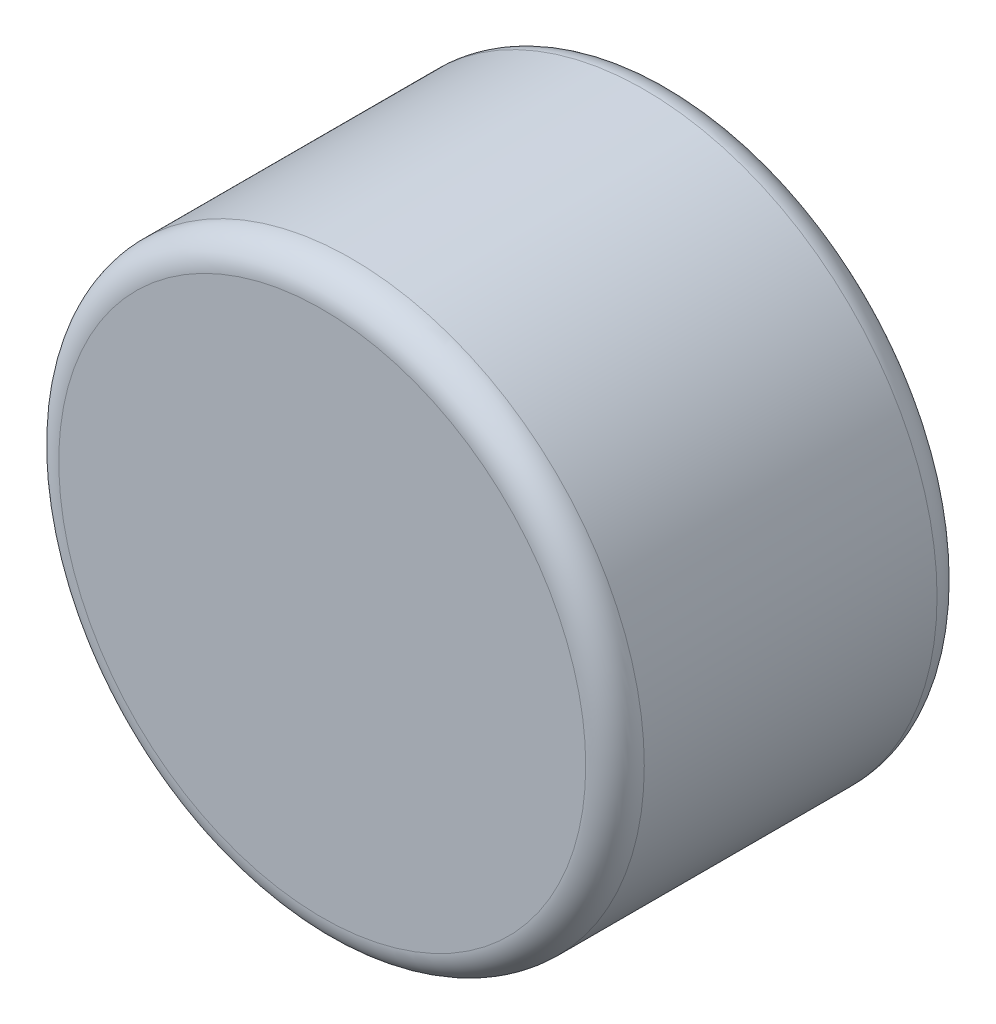
ISO-10303-21;
HEADER;
FILE_DESCRIPTION(('STEP AP214'),'2;1');
FILE_NAME('part.step','',(''),(''),'','','');
FILE_SCHEMA(('AUTOMOTIVE_DESIGN { 1 0 10303 214 1 1 1 1 }'));
ENDSEC;
DATA;
#1=APPLICATION_CONTEXT('core data for automotive mechanical design processes');
#2=APPLICATION_PROTOCOL_DEFINITION('international standard','automotive_design',2000,#1);
#3=PRODUCT_CONTEXT('',#1,'mechanical');
#4=PRODUCT('Part','Part','',(#3));
#5=PRODUCT_RELATED_PRODUCT_CATEGORY('part','',(#4));
#6=PRODUCT_DEFINITION_FORMATION('','',#4);
#7=PRODUCT_DEFINITION_CONTEXT('part definition',#1,'design');
#8=PRODUCT_DEFINITION('design','',#6,#7);
#9=PRODUCT_DEFINITION_SHAPE('','',#8);
#10=(LENGTH_UNIT() NAMED_UNIT(*) SI_UNIT(.MILLI.,.METRE.));
#11=(NAMED_UNIT(*) PLANE_ANGLE_UNIT() SI_UNIT($,.RADIAN.));
#12=(NAMED_UNIT(*) SI_UNIT($,.STERADIAN.) SOLID_ANGLE_UNIT());
#13=UNCERTAINTY_MEASURE_WITH_UNIT(LENGTH_MEASURE(1.E-05),#10,'distance_accuracy_value','');
#14=(GEOMETRIC_REPRESENTATION_CONTEXT(3) GLOBAL_UNCERTAINTY_ASSIGNED_CONTEXT((#13)) GLOBAL_UNIT_ASSIGNED_CONTEXT((#10,
#11,#12)) REPRESENTATION_CONTEXT('',''));
#15=CARTESIAN_POINT('',(0.,0.,0.));
#16=DIRECTION('',(0.,0.,1.));
#17=DIRECTION('',(1.,0.,0.));
#18=AXIS2_PLACEMENT_3D('',#15,#16,#17);
#19=CARTESIAN_POINT('',(0.,0.,3.));
#20=DIRECTION('',(0.,0.,-1.));
#21=DIRECTION('',(-1.,0.,0.));
#22=AXIS2_PLACEMENT_3D('',#19,#20,#21);
#23=CYLINDRICAL_SURFACE('',#22,2.5);
#24=CARTESIAN_POINT('',(0.,0.,0.25));
#25=DIRECTION('',(0.,0.,1.));
#26=DIRECTION('',(1.,0.,0.));
#27=AXIS2_PLACEMENT_3D('',#24,#25,#26);
#28=CIRCLE('',#27,2.5);
#29=CARTESIAN_POINT('',(2.5,0.,0.25));
#30=VERTEX_POINT('',#29);
#31=EDGE_CURVE('E56',#30,#30,#28,.T.);
#32=ORIENTED_EDGE('',*,*,#31,.T.);
#33=EDGE_LOOP('',(#32));
#34=FACE_BOUND('',#33,.T.);
#35=CARTESIAN_POINT('',(0.,0.,2.75));
#36=DIRECTION('',(0.,0.,1.));
#37=DIRECTION('',(1.,0.,0.));
#38=AXIS2_PLACEMENT_3D('',#35,#36,#37);
#39=CIRCLE('',#38,2.5);
#40=CARTESIAN_POINT('',(2.5,0.,2.75));
#41=VERTEX_POINT('',#40);
#42=EDGE_CURVE('E61',#41,#41,#39,.F.);
#43=ORIENTED_EDGE('',*,*,#42,.T.);
#44=EDGE_LOOP('',(#43));
#45=FACE_BOUND('',#44,.T.);
#46=ADVANCED_FACE('F43',(#34,#45),#23,.T.);
#47=CARTESIAN_POINT('',(0.,0.,3.));
#48=DIRECTION('',(0.,0.,1.));
#49=DIRECTION('',(1.,0.,0.));
#50=AXIS2_PLACEMENT_3D('',#47,#48,#49);
#51=PLANE('',#50);
#52=CARTESIAN_POINT('',(0.,0.,3.));
#53=DIRECTION('',(0.,0.,1.));
#54=DIRECTION('',(1.,0.,0.));
#55=AXIS2_PLACEMENT_3D('',#52,#53,#54);
#56=CIRCLE('',#55,2.25);
#57=CARTESIAN_POINT('',(2.25,0.,3.));
#58=VERTEX_POINT('',#57);
#59=EDGE_CURVE('E10',#58,#58,#56,.T.);
#60=ORIENTED_EDGE('',*,*,#59,.T.);
#61=EDGE_LOOP('',(#60));
#62=FACE_BOUND('',#61,.T.);
#63=ADVANCED_FACE('F78',(#62),#51,.T.);
#64=CARTESIAN_POINT('',(0.,0.,0.));
#65=DIRECTION('',(0.,0.,1.));
#66=DIRECTION('',(1.,0.,0.));
#67=AXIS2_PLACEMENT_3D('',#64,#65,#66);
#68=PLANE('',#67);
#69=CARTESIAN_POINT('',(0.,0.,0.));
#70=DIRECTION('',(0.,0.,1.));
#71=DIRECTION('',(1.,0.,0.));
#72=AXIS2_PLACEMENT_3D('',#69,#70,#71);
#73=CIRCLE('',#72,2.25);
#74=CARTESIAN_POINT('',(2.25,0.,0.));
#75=VERTEX_POINT('',#74);
#76=EDGE_CURVE('E51',#75,#75,#73,.F.);
#77=ORIENTED_EDGE('',*,*,#76,.T.);
#78=EDGE_LOOP('',(#77));
#79=FACE_BOUND('',#78,.T.);
#80=ADVANCED_FACE('F75',(#79),#68,.F.);
#81=CARTESIAN_POINT('',(0.,0.,0.25));
#82=DIRECTION('',(0.,0.,1.));
#83=DIRECTION('',(1.,0.,0.));
#84=AXIS2_PLACEMENT_3D('',#81,#82,#83);
#85=TOROIDAL_SURFACE('',#84,2.25,0.25);
#86=ORIENTED_EDGE('',*,*,#76,.F.);
#87=EDGE_LOOP('',(#86));
#88=FACE_BOUND('',#87,.T.);
#89=ORIENTED_EDGE('',*,*,#31,.F.);
#90=EDGE_LOOP('',(#89));
#91=FACE_BOUND('',#90,.T.);
#92=ADVANCED_FACE('F71',(#88,#91),#85,.T.);
#93=CARTESIAN_POINT('',(0.,0.,2.75));
#94=DIRECTION('',(0.,0.,1.));
#95=DIRECTION('',(1.,0.,0.));
#96=AXIS2_PLACEMENT_3D('',#93,#94,#95);
#97=TOROIDAL_SURFACE('',#96,2.25,0.25);
#98=ORIENTED_EDGE('',*,*,#42,.F.);
#99=EDGE_LOOP('',(#98));
#100=FACE_BOUND('',#99,.T.);
#101=ORIENTED_EDGE('',*,*,#59,.F.);
#102=EDGE_LOOP('',(#101));
#103=FACE_BOUND('',#102,.T.);
#104=ADVANCED_FACE('F45',(#100,#103),#97,.T.);
#105=CLOSED_SHELL('',(#46,#63,#80,#92,#104));
#106=MANIFOLD_SOLID_BREP('B2',#105);
#107=ADVANCED_BREP_SHAPE_REPRESENTATION('',(#18,#106),#14);
#108=SHAPE_DEFINITION_REPRESENTATION(#9,#107);
ENDSEC;
END-ISO-10303-21;
